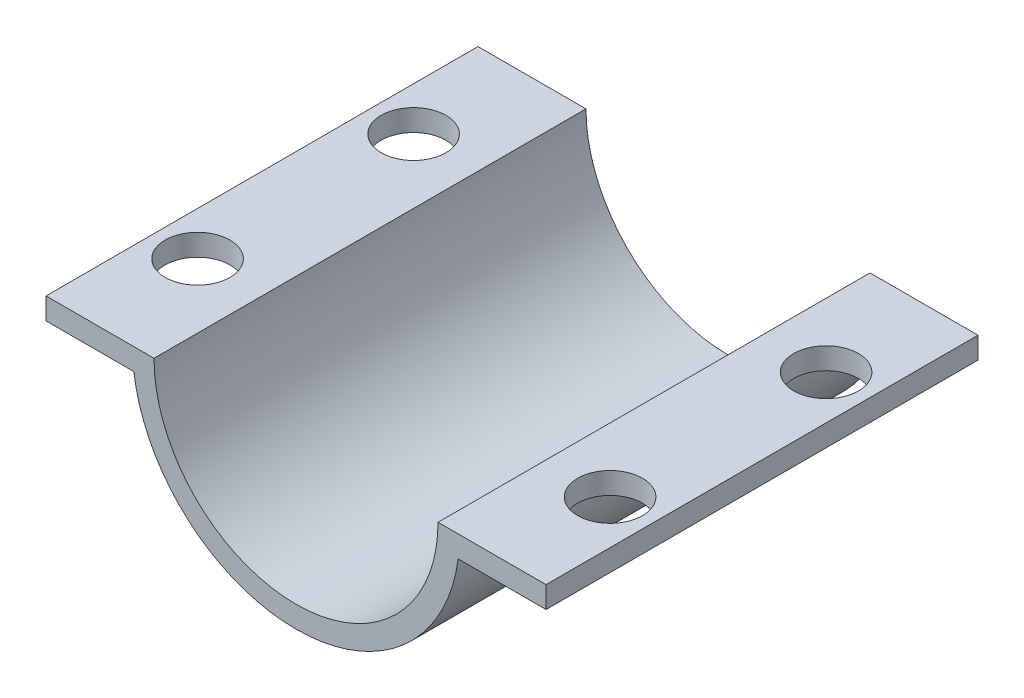
ISO-10303-21;
HEADER;
FILE_DESCRIPTION(('STEP AP214'),'2;1');
FILE_NAME('part.step','',(''),(''),'','','');
FILE_SCHEMA(('AUTOMOTIVE_DESIGN { 1 0 10303 214 1 1 1 1 }'));
ENDSEC;
DATA;
#1=APPLICATION_CONTEXT('core data for automotive mechanical design processes');
#2=APPLICATION_PROTOCOL_DEFINITION('international standard','automotive_design',2000,#1);
#3=PRODUCT_CONTEXT('',#1,'mechanical');
#4=PRODUCT('Part','Part','',(#3));
#5=PRODUCT_RELATED_PRODUCT_CATEGORY('part','',(#4));
#6=PRODUCT_DEFINITION_FORMATION('','',#4);
#7=PRODUCT_DEFINITION_CONTEXT('part definition',#1,'design');
#8=PRODUCT_DEFINITION('design','',#6,#7);
#9=PRODUCT_DEFINITION_SHAPE('','',#8);
#10=(LENGTH_UNIT() NAMED_UNIT(*) SI_UNIT(.MILLI.,.METRE.));
#11=(NAMED_UNIT(*) PLANE_ANGLE_UNIT() SI_UNIT($,.RADIAN.));
#12=(NAMED_UNIT(*) SI_UNIT($,.STERADIAN.) SOLID_ANGLE_UNIT());
#13=UNCERTAINTY_MEASURE_WITH_UNIT(LENGTH_MEASURE(1.E-05),#10,'distance_accuracy_value','');
#14=(GEOMETRIC_REPRESENTATION_CONTEXT(3) GLOBAL_UNCERTAINTY_ASSIGNED_CONTEXT((#13)) GLOBAL_UNIT_ASSIGNED_CONTEXT((#10,
#11,#12)) REPRESENTATION_CONTEXT('',''));
#15=CARTESIAN_POINT('',(0.,0.,0.));
#16=DIRECTION('',(0.,0.,1.));
#17=DIRECTION('',(1.,0.,0.));
#18=AXIS2_PLACEMENT_3D('',#15,#16,#17);
#19=CARTESIAN_POINT('',(16.7005,-2.54,25.4));
#20=DIRECTION('',(0.,1.,0.));
#21=DIRECTION('',(-1.,0.,0.));
#22=AXIS2_PLACEMENT_3D('',#19,#20,#21);
#23=PLANE('',#22);
#24=CARTESIAN_POINT('',(24.2363031700751,-2.54,12.7));
#25=DIRECTION('',(0.,-1.,0.));
#26=DIRECTION('',(0.,0.,-1.));
#27=AXIS2_PLACEMENT_3D('',#24,#25,#26);
#28=CIRCLE('',#27,3.81);
#29=CARTESIAN_POINT('',(24.2363031700751,-2.54,8.89));
#30=VERTEX_POINT('',#29);
#31=EDGE_CURVE('E213',#30,#30,#28,.T.);
#32=ORIENTED_EDGE('',*,*,#31,.F.);
#33=EDGE_LOOP('',(#32));
#34=FACE_BOUND('',#33,.T.);
#35=CARTESIAN_POINT('',(24.2363031700751,-2.54,-12.7));
#36=DIRECTION('',(0.,-1.,0.));
#37=DIRECTION('',(0.,0.,-1.));
#38=AXIS2_PLACEMENT_3D('',#35,#36,#37);
#39=CIRCLE('',#38,3.81);
#40=CARTESIAN_POINT('',(24.2363031700751,-2.54,-16.51));
#41=VERTEX_POINT('',#40);
#42=EDGE_CURVE('E159',#41,#41,#39,.T.);
#43=ORIENTED_EDGE('',*,*,#42,.F.);
#44=EDGE_LOOP('',(#43));
#45=FACE_BOUND('',#44,.T.);
#46=DIRECTION('',(1.,0.,0.));
#47=VECTOR('',#46,1.);
#48=CARTESIAN_POINT('',(16.7005,-2.54,-25.4));
#49=LINE('',#48,#47);
#50=CARTESIAN_POINT('',(19.0721063401503,-2.54,-25.4));
#51=VERTEX_POINT('',#50);
#52=CARTESIAN_POINT('',(29.4005,-2.54,-25.4));
#53=VERTEX_POINT('',#52);
#54=EDGE_CURVE('E132',#51,#53,#49,.T.);
#55=ORIENTED_EDGE('',*,*,#54,.T.);
#56=DIRECTION('',(0.,0.,-1.));
#57=VECTOR('',#56,1.);
#58=CARTESIAN_POINT('',(29.4005,-2.54,25.4));
#59=LINE('',#58,#57);
#60=CARTESIAN_POINT('',(29.4005,-2.54,25.4));
#61=VERTEX_POINT('',#60);
#62=EDGE_CURVE('E11',#61,#53,#59,.T.);
#63=ORIENTED_EDGE('',*,*,#62,.F.);
#64=DIRECTION('',(1.,0.,0.));
#65=VECTOR('',#64,1.);
#66=CARTESIAN_POINT('',(16.7005,-2.54,25.4));
#67=LINE('',#66,#65);
#68=CARTESIAN_POINT('',(19.0721063401503,-2.54,25.4));
#69=VERTEX_POINT('',#68);
#70=EDGE_CURVE('E90',#69,#61,#67,.T.);
#71=ORIENTED_EDGE('',*,*,#70,.F.);
#72=DIRECTION('',(0.,0.,-1.));
#73=VECTOR('',#72,1.);
#74=CARTESIAN_POINT('',(19.0721063401503,-2.54,25.4));
#75=LINE('',#74,#73);
#76=EDGE_CURVE('E131',#69,#51,#75,.T.);
#77=ORIENTED_EDGE('',*,*,#76,.T.);
#78=EDGE_LOOP('',(#55,#63,#71,#77));
#79=FACE_BOUND('',#78,.T.);
#80=ADVANCED_FACE('F33',(#34,#45,#79),#23,.F.);
#81=CARTESIAN_POINT('',(29.4005,0.,25.4));
#82=DIRECTION('',(1.,0.,0.));
#83=DIRECTION('',(0.,0.,-1.));
#84=AXIS2_PLACEMENT_3D('',#81,#82,#83);
#85=PLANE('',#84);
#86=DIRECTION('',(0.,-1.,0.));
#87=VECTOR('',#86,1.);
#88=CARTESIAN_POINT('',(29.4005,0.,-25.4));
#89=LINE('',#88,#87);
#90=CARTESIAN_POINT('',(29.4005,0.,-25.4));
#91=VERTEX_POINT('',#90);
#92=EDGE_CURVE('E135',#91,#53,#89,.T.);
#93=ORIENTED_EDGE('',*,*,#92,.F.);
#94=DIRECTION('',(0.,0.,-1.));
#95=VECTOR('',#94,1.);
#96=CARTESIAN_POINT('',(29.4005,0.,25.4));
#97=LINE('',#96,#95);
#98=CARTESIAN_POINT('',(29.4005,0.,25.4));
#99=VERTEX_POINT('',#98);
#100=EDGE_CURVE('E42',#99,#91,#97,.T.);
#101=ORIENTED_EDGE('',*,*,#100,.F.);
#102=DIRECTION('',(0.,-1.,0.));
#103=VECTOR('',#102,1.);
#104=CARTESIAN_POINT('',(29.4005,0.,25.4));
#105=LINE('',#104,#103);
#106=EDGE_CURVE('E172',#99,#61,#105,.T.);
#107=ORIENTED_EDGE('',*,*,#106,.T.);
#108=ORIENTED_EDGE('',*,*,#62,.T.);
#109=EDGE_LOOP('',(#93,#101,#107,#108));
#110=FACE_BOUND('',#109,.T.);
#111=ADVANCED_FACE('F203',(#110),#85,.T.);
#112=CARTESIAN_POINT('',(16.7005,0.,25.4));
#113=DIRECTION('',(0.,1.,0.));
#114=DIRECTION('',(-1.,0.,0.));
#115=AXIS2_PLACEMENT_3D('',#112,#113,#114);
#116=PLANE('',#115);
#117=CARTESIAN_POINT('',(24.2363031700751,0.,12.7));
#118=DIRECTION('',(0.,1.,0.));
#119=DIRECTION('',(-1.,0.,0.));
#120=AXIS2_PLACEMENT_3D('',#117,#118,#119);
#121=CIRCLE('',#120,3.81);
#122=CARTESIAN_POINT('',(20.4263031700751,0.,12.7));
#123=VERTEX_POINT('',#122);
#124=EDGE_CURVE('E36',#123,#123,#121,.T.);
#125=ORIENTED_EDGE('',*,*,#124,.F.);
#126=EDGE_LOOP('',(#125));
#127=FACE_BOUND('',#126,.T.);
#128=CARTESIAN_POINT('',(24.2363031700751,0.,-12.7));
#129=DIRECTION('',(0.,1.,0.));
#130=DIRECTION('',(-1.,0.,0.));
#131=AXIS2_PLACEMENT_3D('',#128,#129,#130);
#132=CIRCLE('',#131,3.81);
#133=CARTESIAN_POINT('',(20.4263031700751,0.,-12.7));
#134=VERTEX_POINT('',#133);
#135=EDGE_CURVE('E136',#134,#134,#132,.T.);
#136=ORIENTED_EDGE('',*,*,#135,.F.);
#137=EDGE_LOOP('',(#136));
#138=FACE_BOUND('',#137,.T.);
#139=DIRECTION('',(1.,0.,0.));
#140=VECTOR('',#139,1.);
#141=CARTESIAN_POINT('',(16.7005,0.,-25.4));
#142=LINE('',#141,#140);
#143=CARTESIAN_POINT('',(16.7005,0.,-25.4));
#144=VERTEX_POINT('',#143);
#145=EDGE_CURVE('E139',#144,#91,#142,.T.);
#146=ORIENTED_EDGE('',*,*,#145,.F.);
#147=DIRECTION('',(0.,0.,-1.));
#148=VECTOR('',#147,1.);
#149=CARTESIAN_POINT('',(16.7005,0.,25.4));
#150=LINE('',#149,#148);
#151=CARTESIAN_POINT('',(16.7005,0.,25.4));
#152=VERTEX_POINT('',#151);
#153=EDGE_CURVE('E156',#152,#144,#150,.T.);
#154=ORIENTED_EDGE('',*,*,#153,.F.);
#155=DIRECTION('',(1.,0.,0.));
#156=VECTOR('',#155,1.);
#157=CARTESIAN_POINT('',(16.7005,0.,25.4));
#158=LINE('',#157,#156);
#159=EDGE_CURVE('E175',#152,#99,#158,.T.);
#160=ORIENTED_EDGE('',*,*,#159,.T.);
#161=ORIENTED_EDGE('',*,*,#100,.T.);
#162=EDGE_LOOP('',(#146,#154,#160,#161));
#163=FACE_BOUND('',#162,.T.);
#164=ADVANCED_FACE('F208',(#127,#138,#163),#116,.T.);
#165=CARTESIAN_POINT('',(0.,0.,25.4));
#166=DIRECTION('',(0.,0.,-1.));
#167=DIRECTION('',(-1.,0.,0.));
#168=AXIS2_PLACEMENT_3D('',#165,#166,#167);
#169=CYLINDRICAL_SURFACE('',#168,16.7005);
#170=CARTESIAN_POINT('',(0.,0.,-25.4));
#171=DIRECTION('',(0.,0.,1.));
#172=DIRECTION('',(1.,0.,0.));
#173=AXIS2_PLACEMENT_3D('',#170,#171,#172);
#174=CIRCLE('',#173,16.7005);
#175=CARTESIAN_POINT('',(-16.7005,0.,-25.4));
#176=VERTEX_POINT('',#175);
#177=EDGE_CURVE('E142',#176,#144,#174,.T.);
#178=ORIENTED_EDGE('',*,*,#177,.F.);
#179=DIRECTION('',(0.,0.,-1.));
#180=VECTOR('',#179,1.);
#181=CARTESIAN_POINT('',(-16.7005,0.,25.4));
#182=LINE('',#181,#180);
#183=CARTESIAN_POINT('',(-16.7005,0.,25.4));
#184=VERTEX_POINT('',#183);
#185=EDGE_CURVE('E154',#184,#176,#182,.T.);
#186=ORIENTED_EDGE('',*,*,#185,.F.);
#187=CARTESIAN_POINT('',(0.,0.,25.4));
#188=DIRECTION('',(0.,0.,1.));
#189=DIRECTION('',(1.,0.,0.));
#190=AXIS2_PLACEMENT_3D('',#187,#188,#189);
#191=CIRCLE('',#190,16.7005);
#192=EDGE_CURVE('E126',#184,#152,#191,.T.);
#193=ORIENTED_EDGE('',*,*,#192,.T.);
#194=ORIENTED_EDGE('',*,*,#153,.T.);
#195=EDGE_LOOP('',(#178,#186,#193,#194));
#196=FACE_BOUND('',#195,.T.);
#197=ADVANCED_FACE('F180',(#196),#169,.F.);
#198=CARTESIAN_POINT('',(-16.7005,0.,25.4));
#199=DIRECTION('',(0.,1.,0.));
#200=DIRECTION('',(-1.,0.,0.));
#201=AXIS2_PLACEMENT_3D('',#198,#199,#200);
#202=PLANE('',#201);
#203=CARTESIAN_POINT('',(-24.2776968299249,0.,-12.7000000000003));
#204=DIRECTION('',(0.,1.,0.));
#205=DIRECTION('',(-1.,0.,0.));
#206=AXIS2_PLACEMENT_3D('',#203,#204,#205);
#207=CIRCLE('',#206,3.81);
#208=CARTESIAN_POINT('',(-28.0876968299249,0.,-12.7000000000003));
#209=VERTEX_POINT('',#208);
#210=EDGE_CURVE('E167',#209,#209,#207,.T.);
#211=ORIENTED_EDGE('',*,*,#210,.F.);
#212=EDGE_LOOP('',(#211));
#213=FACE_BOUND('',#212,.T.);
#214=CARTESIAN_POINT('',(-24.2776968299249,0.,12.6999999999997));
#215=DIRECTION('',(0.,1.,0.));
#216=DIRECTION('',(-1.,0.,0.));
#217=AXIS2_PLACEMENT_3D('',#214,#215,#216);
#218=CIRCLE('',#217,3.81);
#219=CARTESIAN_POINT('',(-28.0876968299249,0.,12.6999999999997));
#220=VERTEX_POINT('',#219);
#221=EDGE_CURVE('E215',#220,#220,#218,.T.);
#222=ORIENTED_EDGE('',*,*,#221,.F.);
#223=EDGE_LOOP('',(#222));
#224=FACE_BOUND('',#223,.T.);
#225=DIRECTION('',(1.,0.,0.));
#226=VECTOR('',#225,1.);
#227=CARTESIAN_POINT('',(-16.7005,0.,-25.4));
#228=LINE('',#227,#226);
#229=CARTESIAN_POINT('',(-29.4005,0.,-25.4));
#230=VERTEX_POINT('',#229);
#231=EDGE_CURVE('E145',#230,#176,#228,.T.);
#232=ORIENTED_EDGE('',*,*,#231,.F.);
#233=DIRECTION('',(0.,0.,-1.));
#234=VECTOR('',#233,1.);
#235=CARTESIAN_POINT('',(-29.4005,0.,25.4));
#236=LINE('',#235,#234);
#237=CARTESIAN_POINT('',(-29.4005,0.,25.4));
#238=VERTEX_POINT('',#237);
#239=EDGE_CURVE('E114',#238,#230,#236,.T.);
#240=ORIENTED_EDGE('',*,*,#239,.F.);
#241=DIRECTION('',(1.,0.,0.));
#242=VECTOR('',#241,1.);
#243=CARTESIAN_POINT('',(-16.7005,0.,25.4));
#244=LINE('',#243,#242);
#245=EDGE_CURVE('E124',#238,#184,#244,.T.);
#246=ORIENTED_EDGE('',*,*,#245,.T.);
#247=ORIENTED_EDGE('',*,*,#185,.T.);
#248=EDGE_LOOP('',(#232,#240,#246,#247));
#249=FACE_BOUND('',#248,.T.);
#250=ADVANCED_FACE('F185',(#213,#224,#249),#202,.T.);
#251=CARTESIAN_POINT('',(-29.4005,-2.54,25.4));
#252=DIRECTION('',(-1.,0.,0.));
#253=DIRECTION('',(0.,0.,1.));
#254=AXIS2_PLACEMENT_3D('',#251,#252,#253);
#255=PLANE('',#254);
#256=DIRECTION('',(0.,1.,0.));
#257=VECTOR('',#256,1.);
#258=CARTESIAN_POINT('',(-29.4005,-2.54,-25.4));
#259=LINE('',#258,#257);
#260=CARTESIAN_POINT('',(-29.4005,-2.54,-25.4));
#261=VERTEX_POINT('',#260);
#262=EDGE_CURVE('E113',#261,#230,#259,.T.);
#263=ORIENTED_EDGE('',*,*,#262,.F.);
#264=DIRECTION('',(0.,0.,-1.));
#265=VECTOR('',#264,1.);
#266=CARTESIAN_POINT('',(-29.4005,-2.54,25.4));
#267=LINE('',#266,#265);
#268=CARTESIAN_POINT('',(-29.4005,-2.54,25.4));
#269=VERTEX_POINT('',#268);
#270=EDGE_CURVE('E107',#269,#261,#267,.T.);
#271=ORIENTED_EDGE('',*,*,#270,.F.);
#272=DIRECTION('',(0.,1.,0.));
#273=VECTOR('',#272,1.);
#274=CARTESIAN_POINT('',(-29.4005,-2.54,25.4));
#275=LINE('',#274,#273);
#276=EDGE_CURVE('E111',#269,#238,#275,.T.);
#277=ORIENTED_EDGE('',*,*,#276,.T.);
#278=ORIENTED_EDGE('',*,*,#239,.T.);
#279=EDGE_LOOP('',(#263,#271,#277,#278));
#280=FACE_BOUND('',#279,.T.);
#281=ADVANCED_FACE('F109',(#280),#255,.T.);
#282=CARTESIAN_POINT('',(-16.7005,-2.54,25.4));
#283=DIRECTION('',(0.,1.,0.));
#284=DIRECTION('',(-1.,0.,0.));
#285=AXIS2_PLACEMENT_3D('',#282,#283,#284);
#286=PLANE('',#285);
#287=CARTESIAN_POINT('',(-24.2776968299249,-2.54,-12.7000000000003));
#288=DIRECTION('',(0.,-1.,0.));
#289=DIRECTION('',(0.,0.,-1.));
#290=AXIS2_PLACEMENT_3D('',#287,#288,#289);
#291=CIRCLE('',#290,3.81);
#292=CARTESIAN_POINT('',(-24.2776968299249,-2.54,-16.5100000000003));
#293=VERTEX_POINT('',#292);
#294=EDGE_CURVE('E216',#293,#293,#291,.T.);
#295=ORIENTED_EDGE('',*,*,#294,.F.);
#296=EDGE_LOOP('',(#295));
#297=FACE_BOUND('',#296,.T.);
#298=CARTESIAN_POINT('',(-24.2776968299249,-2.54,12.6999999999997));
#299=DIRECTION('',(0.,-1.,0.));
#300=DIRECTION('',(0.,0.,-1.));
#301=AXIS2_PLACEMENT_3D('',#298,#299,#300);
#302=CIRCLE('',#301,3.81);
#303=CARTESIAN_POINT('',(-24.2776968299249,-2.54,8.88999999999966));
#304=VERTEX_POINT('',#303);
#305=EDGE_CURVE('E220',#304,#304,#302,.T.);
#306=ORIENTED_EDGE('',*,*,#305,.F.);
#307=EDGE_LOOP('',(#306));
#308=FACE_BOUND('',#307,.T.);
#309=DIRECTION('',(1.,0.,0.));
#310=VECTOR('',#309,1.);
#311=CARTESIAN_POINT('',(-16.7005,-2.54,-25.4));
#312=LINE('',#311,#310);
#313=CARTESIAN_POINT('',(-19.0721063401503,-2.54,-25.4));
#314=VERTEX_POINT('',#313);
#315=EDGE_CURVE('E78',#261,#314,#312,.T.);
#316=ORIENTED_EDGE('',*,*,#315,.T.);
#317=DIRECTION('',(0.,0.,-1.));
#318=VECTOR('',#317,1.);
#319=CARTESIAN_POINT('',(-19.0721063401503,-2.54,25.4));
#320=LINE('',#319,#318);
#321=CARTESIAN_POINT('',(-19.0721063401503,-2.54,25.4));
#322=VERTEX_POINT('',#321);
#323=EDGE_CURVE('E115',#322,#314,#320,.T.);
#324=ORIENTED_EDGE('',*,*,#323,.F.);
#325=DIRECTION('',(1.,0.,0.));
#326=VECTOR('',#325,1.);
#327=CARTESIAN_POINT('',(-16.7005,-2.54,25.4));
#328=LINE('',#327,#326);
#329=EDGE_CURVE('E117',#269,#322,#328,.T.);
#330=ORIENTED_EDGE('',*,*,#329,.F.);
#331=ORIENTED_EDGE('',*,*,#270,.T.);
#332=EDGE_LOOP('',(#316,#324,#330,#331));
#333=FACE_BOUND('',#332,.T.);
#334=ADVANCED_FACE('F118',(#297,#308,#333),#286,.F.);
#335=CARTESIAN_POINT('',(0.,0.,25.4));
#336=DIRECTION('',(0.,0.,-1.));
#337=DIRECTION('',(-1.,0.,0.));
#338=AXIS2_PLACEMENT_3D('',#335,#336,#337);
#339=CYLINDRICAL_SURFACE('',#338,19.2405);
#340=CARTESIAN_POINT('',(0.,0.,-25.4));
#341=DIRECTION('',(0.,0.,1.));
#342=DIRECTION('',(1.,0.,0.));
#343=AXIS2_PLACEMENT_3D('',#340,#341,#342);
#344=CIRCLE('',#343,19.2405);
#345=EDGE_CURVE('E84',#314,#51,#344,.T.);
#346=ORIENTED_EDGE('',*,*,#345,.T.);
#347=ORIENTED_EDGE('',*,*,#76,.F.);
#348=CARTESIAN_POINT('',(0.,0.,25.4));
#349=DIRECTION('',(0.,0.,1.));
#350=DIRECTION('',(1.,0.,0.));
#351=AXIS2_PLACEMENT_3D('',#348,#349,#350);
#352=CIRCLE('',#351,19.2405);
#353=EDGE_CURVE('E51',#322,#69,#352,.T.);
#354=ORIENTED_EDGE('',*,*,#353,.F.);
#355=ORIENTED_EDGE('',*,*,#323,.T.);
#356=EDGE_LOOP('',(#346,#347,#354,#355));
#357=FACE_BOUND('',#356,.T.);
#358=ADVANCED_FACE('F191',(#357),#339,.T.);
#359=CARTESIAN_POINT('',(0.,0.,25.4));
#360=DIRECTION('',(0.,0.,1.));
#361=DIRECTION('',(1.,0.,0.));
#362=AXIS2_PLACEMENT_3D('',#359,#360,#361);
#363=PLANE('',#362);
#364=ORIENTED_EDGE('',*,*,#70,.T.);
#365=ORIENTED_EDGE('',*,*,#106,.F.);
#366=ORIENTED_EDGE('',*,*,#159,.F.);
#367=ORIENTED_EDGE('',*,*,#192,.F.);
#368=ORIENTED_EDGE('',*,*,#245,.F.);
#369=ORIENTED_EDGE('',*,*,#276,.F.);
#370=ORIENTED_EDGE('',*,*,#329,.T.);
#371=ORIENTED_EDGE('',*,*,#353,.T.);
#372=EDGE_LOOP('',(#364,#365,#366,#367,#368,#369,#370,#371));
#373=FACE_BOUND('',#372,.T.);
#374=ADVANCED_FACE('F121',(#373),#363,.T.);
#375=CARTESIAN_POINT('',(0.,0.,-25.4));
#376=DIRECTION('',(0.,0.,1.));
#377=DIRECTION('',(1.,0.,0.));
#378=AXIS2_PLACEMENT_3D('',#375,#376,#377);
#379=PLANE('',#378);
#380=ORIENTED_EDGE('',*,*,#54,.F.);
#381=ORIENTED_EDGE('',*,*,#345,.F.);
#382=ORIENTED_EDGE('',*,*,#315,.F.);
#383=ORIENTED_EDGE('',*,*,#262,.T.);
#384=ORIENTED_EDGE('',*,*,#231,.T.);
#385=ORIENTED_EDGE('',*,*,#177,.T.);
#386=ORIENTED_EDGE('',*,*,#145,.T.);
#387=ORIENTED_EDGE('',*,*,#92,.T.);
#388=EDGE_LOOP('',(#380,#381,#382,#383,#384,#385,#386,#387));
#389=FACE_BOUND('',#388,.T.);
#390=ADVANCED_FACE('F188',(#389),#379,.F.);
#391=CARTESIAN_POINT('',(24.2363031700751,5.588,-12.7));
#392=DIRECTION('',(0.,-1.,0.));
#393=DIRECTION('',(0.,0.,-1.));
#394=AXIS2_PLACEMENT_3D('',#391,#392,#393);
#395=CYLINDRICAL_SURFACE('',#394,3.81);
#396=ORIENTED_EDGE('',*,*,#135,.T.);
#397=EDGE_LOOP('',(#396));
#398=FACE_BOUND('',#397,.T.);
#399=ORIENTED_EDGE('',*,*,#42,.T.);
#400=EDGE_LOOP('',(#399));
#401=FACE_BOUND('',#400,.T.);
#402=ADVANCED_FACE('F230',(#398,#401),#395,.F.);
#403=CARTESIAN_POINT('',(-24.2776968299249,5.588,12.6999999999997));
#404=DIRECTION('',(0.,-1.,0.));
#405=DIRECTION('',(0.,0.,-1.));
#406=AXIS2_PLACEMENT_3D('',#403,#404,#405);
#407=CYLINDRICAL_SURFACE('',#406,3.81);
#408=ORIENTED_EDGE('',*,*,#221,.T.);
#409=EDGE_LOOP('',(#408));
#410=FACE_BOUND('',#409,.T.);
#411=ORIENTED_EDGE('',*,*,#305,.T.);
#412=EDGE_LOOP('',(#411));
#413=FACE_BOUND('',#412,.T.);
#414=ADVANCED_FACE('F226',(#410,#413),#407,.F.);
#415=CARTESIAN_POINT('',(-24.2776968299249,5.588,-12.7000000000003));
#416=DIRECTION('',(0.,-1.,0.));
#417=DIRECTION('',(0.,0.,-1.));
#418=AXIS2_PLACEMENT_3D('',#415,#416,#417);
#419=CYLINDRICAL_SURFACE('',#418,3.81);
#420=ORIENTED_EDGE('',*,*,#210,.T.);
#421=EDGE_LOOP('',(#420));
#422=FACE_BOUND('',#421,.T.);
#423=ORIENTED_EDGE('',*,*,#294,.T.);
#424=EDGE_LOOP('',(#423));
#425=FACE_BOUND('',#424,.T.);
#426=ADVANCED_FACE('F229',(#422,#425),#419,.F.);
#427=CARTESIAN_POINT('',(24.2363031700751,5.588,12.7));
#428=DIRECTION('',(0.,-1.,0.));
#429=DIRECTION('',(0.,0.,-1.));
#430=AXIS2_PLACEMENT_3D('',#427,#428,#429);
#431=CYLINDRICAL_SURFACE('',#430,3.81);
#432=ORIENTED_EDGE('',*,*,#124,.T.);
#433=EDGE_LOOP('',(#432));
#434=FACE_BOUND('',#433,.T.);
#435=ORIENTED_EDGE('',*,*,#31,.T.);
#436=EDGE_LOOP('',(#435));
#437=FACE_BOUND('',#436,.T.);
#438=ADVANCED_FACE('F237',(#434,#437),#431,.F.);
#439=CLOSED_SHELL('',(#80,#111,#164,#197,#250,#281,#334,#358,#374,#390,#402,#414,#426,#438));
#440=MANIFOLD_SOLID_BREP('B2',#439);
#441=ADVANCED_BREP_SHAPE_REPRESENTATION('',(#18,#440),#14);
#442=SHAPE_DEFINITION_REPRESENTATION(#9,#441);
ENDSEC;
END-ISO-10303-21;
